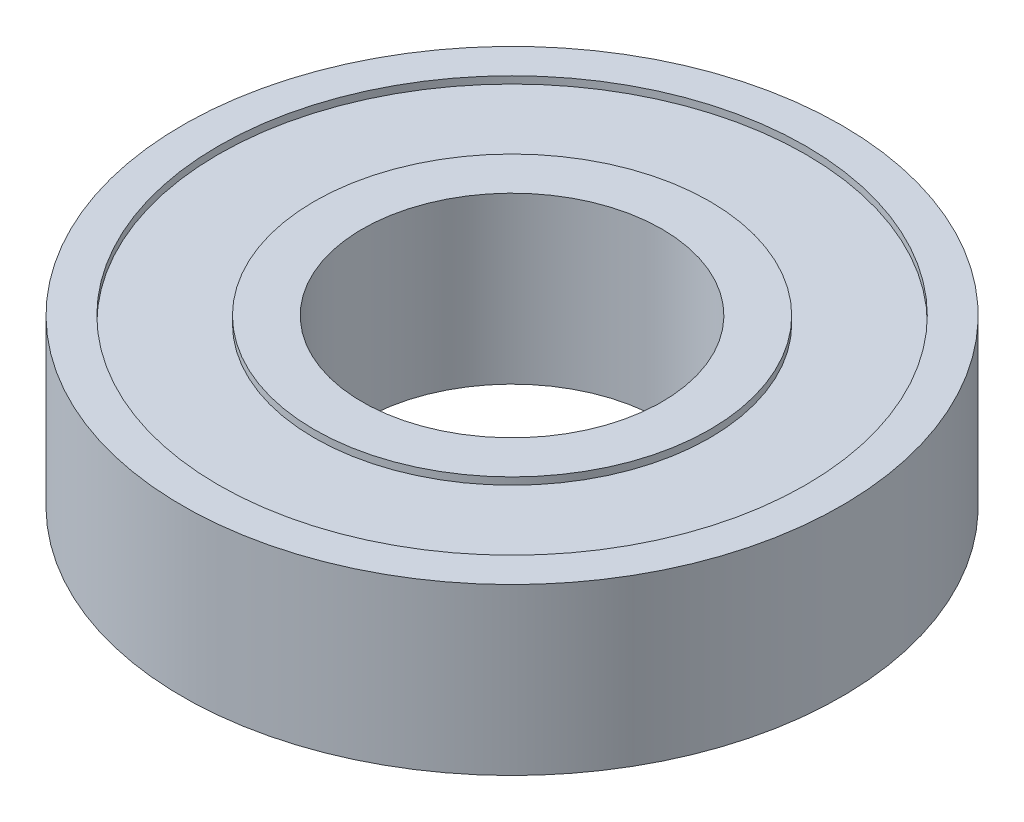
ISO-10303-21;
HEADER;
FILE_DESCRIPTION(('STEP AP214'),'2;1');
FILE_NAME('part.step','',(''),(''),'','','');
FILE_SCHEMA(('AUTOMOTIVE_DESIGN { 1 0 10303 214 1 1 1 1 }'));
ENDSEC;
DATA;
#1=APPLICATION_CONTEXT('core data for automotive mechanical design processes');
#2=APPLICATION_PROTOCOL_DEFINITION('international standard','automotive_design',2000,#1);
#3=PRODUCT_CONTEXT('',#1,'mechanical');
#4=PRODUCT('Part','Part','',(#3));
#5=PRODUCT_RELATED_PRODUCT_CATEGORY('part','',(#4));
#6=PRODUCT_DEFINITION_FORMATION('','',#4);
#7=PRODUCT_DEFINITION_CONTEXT('part definition',#1,'design');
#8=PRODUCT_DEFINITION('design','',#6,#7);
#9=PRODUCT_DEFINITION_SHAPE('','',#8);
#10=(LENGTH_UNIT() NAMED_UNIT(*) SI_UNIT(.MILLI.,.METRE.));
#11=(NAMED_UNIT(*) PLANE_ANGLE_UNIT() SI_UNIT($,.RADIAN.));
#12=(NAMED_UNIT(*) SI_UNIT($,.STERADIAN.) SOLID_ANGLE_UNIT());
#13=UNCERTAINTY_MEASURE_WITH_UNIT(LENGTH_MEASURE(1.E-05),#10,'distance_accuracy_value','');
#14=(GEOMETRIC_REPRESENTATION_CONTEXT(3) GLOBAL_UNCERTAINTY_ASSIGNED_CONTEXT((#13)) GLOBAL_UNIT_ASSIGNED_CONTEXT((#10,
#11,#12)) REPRESENTATION_CONTEXT('',''));
#15=CARTESIAN_POINT('',(0.,0.,0.));
#16=DIRECTION('',(0.,0.,1.));
#17=DIRECTION('',(1.,0.,0.));
#18=AXIS2_PLACEMENT_3D('',#15,#16,#17);
#19=CARTESIAN_POINT('',(7.9375,-0.381,0.));
#20=DIRECTION('',(0.,-1.,0.));
#21=DIRECTION('',(0.,0.,-1.));
#22=AXIS2_PLACEMENT_3D('',#19,#20,#21);
#23=PLANE('',#22);
#24=CARTESIAN_POINT('',(0.,-0.381,0.));
#25=DIRECTION('',(0.,-1.,0.));
#26=DIRECTION('',(0.,0.,-1.));
#27=AXIS2_PLACEMENT_3D('',#24,#25,#26);
#28=CIRCLE('',#27,10.4775);
#29=CARTESIAN_POINT('',(0.,-0.381,-10.4775));
#30=VERTEX_POINT('',#29);
#31=EDGE_CURVE('E10',#30,#30,#28,.T.);
#32=ORIENTED_EDGE('',*,*,#31,.T.);
#33=EDGE_LOOP('',(#32));
#34=FACE_BOUND('',#33,.T.);
#35=CARTESIAN_POINT('',(0.,-0.381,0.));
#36=DIRECTION('',(0.,-1.,0.));
#37=DIRECTION('',(0.,0.,-1.));
#38=AXIS2_PLACEMENT_3D('',#35,#36,#37);
#39=CIRCLE('',#38,7.9375);
#40=CARTESIAN_POINT('',(0.,-0.381,-7.9375));
#41=VERTEX_POINT('',#40);
#42=EDGE_CURVE('E71',#41,#41,#39,.T.);
#43=ORIENTED_EDGE('',*,*,#42,.F.);
#44=EDGE_LOOP('',(#43));
#45=FACE_BOUND('',#44,.T.);
#46=ADVANCED_FACE('F31',(#34,#45),#23,.T.);
#47=CARTESIAN_POINT('',(0.,0.,0.));
#48=DIRECTION('',(0.,-1.,0.));
#49=DIRECTION('',(0.,0.,-1.));
#50=AXIS2_PLACEMENT_3D('',#47,#48,#49);
#51=CYLINDRICAL_SURFACE('',#50,10.4775);
#52=CARTESIAN_POINT('',(0.,0.,0.));
#53=DIRECTION('',(0.,-1.,0.));
#54=DIRECTION('',(0.,0.,-1.));
#55=AXIS2_PLACEMENT_3D('',#52,#53,#54);
#56=CIRCLE('',#55,10.4775);
#57=CARTESIAN_POINT('',(0.,0.,-10.4775));
#58=VERTEX_POINT('',#57);
#59=EDGE_CURVE('E37',#58,#58,#56,.T.);
#60=ORIENTED_EDGE('',*,*,#59,.T.);
#61=EDGE_LOOP('',(#60));
#62=FACE_BOUND('',#61,.T.);
#63=ORIENTED_EDGE('',*,*,#31,.F.);
#64=EDGE_LOOP('',(#63));
#65=FACE_BOUND('',#64,.T.);
#66=ADVANCED_FACE('F79',(#62,#65),#51,.T.);
#67=CARTESIAN_POINT('',(10.4775,0.,0.));
#68=DIRECTION('',(0.,-1.,0.));
#69=DIRECTION('',(0.,0.,-1.));
#70=AXIS2_PLACEMENT_3D('',#67,#68,#69);
#71=PLANE('',#70);
#72=CARTESIAN_POINT('',(0.,0.,0.));
#73=DIRECTION('',(0.,-1.,0.));
#74=DIRECTION('',(0.,0.,-1.));
#75=AXIS2_PLACEMENT_3D('',#72,#73,#74);
#76=CIRCLE('',#75,15.5575);
#77=CARTESIAN_POINT('',(0.,0.,-15.5575));
#78=VERTEX_POINT('',#77);
#79=EDGE_CURVE('E41',#78,#78,#76,.T.);
#80=ORIENTED_EDGE('',*,*,#79,.T.);
#81=EDGE_LOOP('',(#80));
#82=FACE_BOUND('',#81,.T.);
#83=ORIENTED_EDGE('',*,*,#59,.F.);
#84=EDGE_LOOP('',(#83));
#85=FACE_BOUND('',#84,.T.);
#86=ADVANCED_FACE('F83',(#82,#85),#71,.T.);
#87=CARTESIAN_POINT('',(0.,0.,0.));
#88=DIRECTION('',(0.,-1.,0.));
#89=DIRECTION('',(0.,0.,-1.));
#90=AXIS2_PLACEMENT_3D('',#87,#88,#89);
#91=CYLINDRICAL_SURFACE('',#90,15.5575);
#92=CARTESIAN_POINT('',(0.,-0.381,0.));
#93=DIRECTION('',(0.,-1.,0.));
#94=DIRECTION('',(0.,0.,-1.));
#95=AXIS2_PLACEMENT_3D('',#92,#93,#94);
#96=CIRCLE('',#95,15.5575);
#97=CARTESIAN_POINT('',(0.,-0.381,-15.5575));
#98=VERTEX_POINT('',#97);
#99=EDGE_CURVE('E45',#98,#98,#96,.T.);
#100=ORIENTED_EDGE('',*,*,#99,.T.);
#101=EDGE_LOOP('',(#100));
#102=FACE_BOUND('',#101,.T.);
#103=ORIENTED_EDGE('',*,*,#79,.F.);
#104=EDGE_LOOP('',(#103));
#105=FACE_BOUND('',#104,.T.);
#106=ADVANCED_FACE('F87',(#102,#105),#91,.F.);
#107=CARTESIAN_POINT('',(15.5575,-0.381,0.));
#108=DIRECTION('',(0.,-1.,0.));
#109=DIRECTION('',(0.,0.,-1.));
#110=AXIS2_PLACEMENT_3D('',#107,#108,#109);
#111=PLANE('',#110);
#112=CARTESIAN_POINT('',(0.,-0.381,0.));
#113=DIRECTION('',(0.,-1.,0.));
#114=DIRECTION('',(0.,0.,-1.));
#115=AXIS2_PLACEMENT_3D('',#112,#113,#114);
#116=CIRCLE('',#115,17.4625);
#117=CARTESIAN_POINT('',(0.,-0.381,-17.4625));
#118=VERTEX_POINT('',#117);
#119=EDGE_CURVE('E50',#118,#118,#116,.T.);
#120=ORIENTED_EDGE('',*,*,#119,.T.);
#121=EDGE_LOOP('',(#120));
#122=FACE_BOUND('',#121,.T.);
#123=ORIENTED_EDGE('',*,*,#99,.F.);
#124=EDGE_LOOP('',(#123));
#125=FACE_BOUND('',#124,.T.);
#126=ADVANCED_FACE('F94',(#122,#125),#111,.T.);
#127=CARTESIAN_POINT('',(0.,0.,0.));
#128=DIRECTION('',(0.,-1.,0.));
#129=DIRECTION('',(0.,0.,-1.));
#130=AXIS2_PLACEMENT_3D('',#127,#128,#129);
#131=CYLINDRICAL_SURFACE('',#130,17.4625);
#132=CARTESIAN_POINT('',(0.,8.382,0.));
#133=DIRECTION('',(0.,-1.,0.));
#134=DIRECTION('',(0.,0.,-1.));
#135=AXIS2_PLACEMENT_3D('',#132,#133,#134);
#136=CIRCLE('',#135,17.4625);
#137=CARTESIAN_POINT('',(0.,8.382,-17.4625));
#138=VERTEX_POINT('',#137);
#139=EDGE_CURVE('E53',#138,#138,#136,.T.);
#140=ORIENTED_EDGE('',*,*,#139,.T.);
#141=EDGE_LOOP('',(#140));
#142=FACE_BOUND('',#141,.T.);
#143=ORIENTED_EDGE('',*,*,#119,.F.);
#144=EDGE_LOOP('',(#143));
#145=FACE_BOUND('',#144,.T.);
#146=ADVANCED_FACE('F98',(#142,#145),#131,.T.);
#147=CARTESIAN_POINT('',(15.5575,8.382,0.));
#148=DIRECTION('',(0.,1.,0.));
#149=DIRECTION('',(0.,0.,1.));
#150=AXIS2_PLACEMENT_3D('',#147,#148,#149);
#151=PLANE('',#150);
#152=CARTESIAN_POINT('',(0.,8.382,0.));
#153=DIRECTION('',(0.,-1.,0.));
#154=DIRECTION('',(0.,0.,-1.));
#155=AXIS2_PLACEMENT_3D('',#152,#153,#154);
#156=CIRCLE('',#155,15.5575);
#157=CARTESIAN_POINT('',(0.,8.382,-15.5575));
#158=VERTEX_POINT('',#157);
#159=EDGE_CURVE('E56',#158,#158,#156,.T.);
#160=ORIENTED_EDGE('',*,*,#159,.T.);
#161=EDGE_LOOP('',(#160));
#162=FACE_BOUND('',#161,.T.);
#163=ORIENTED_EDGE('',*,*,#139,.F.);
#164=EDGE_LOOP('',(#163));
#165=FACE_BOUND('',#164,.T.);
#166=ADVANCED_FACE('F102',(#162,#165),#151,.T.);
#167=CARTESIAN_POINT('',(0.,0.,0.));
#168=DIRECTION('',(0.,-1.,0.));
#169=DIRECTION('',(0.,0.,-1.));
#170=AXIS2_PLACEMENT_3D('',#167,#168,#169);
#171=CYLINDRICAL_SURFACE('',#170,15.5575);
#172=CARTESIAN_POINT('',(0.,8.001,0.));
#173=DIRECTION('',(0.,-1.,0.));
#174=DIRECTION('',(0.,0.,-1.));
#175=AXIS2_PLACEMENT_3D('',#172,#173,#174);
#176=CIRCLE('',#175,15.5575);
#177=CARTESIAN_POINT('',(0.,8.001,-15.5575));
#178=VERTEX_POINT('',#177);
#179=EDGE_CURVE('E59',#178,#178,#176,.T.);
#180=ORIENTED_EDGE('',*,*,#179,.T.);
#181=EDGE_LOOP('',(#180));
#182=FACE_BOUND('',#181,.T.);
#183=ORIENTED_EDGE('',*,*,#159,.F.);
#184=EDGE_LOOP('',(#183));
#185=FACE_BOUND('',#184,.T.);
#186=ADVANCED_FACE('F106',(#182,#185),#171,.F.);
#187=CARTESIAN_POINT('',(10.4775,8.001,0.));
#188=DIRECTION('',(0.,1.,0.));
#189=DIRECTION('',(0.,0.,1.));
#190=AXIS2_PLACEMENT_3D('',#187,#188,#189);
#191=PLANE('',#190);
#192=CARTESIAN_POINT('',(0.,8.001,0.));
#193=DIRECTION('',(0.,-1.,0.));
#194=DIRECTION('',(0.,0.,-1.));
#195=AXIS2_PLACEMENT_3D('',#192,#193,#194);
#196=CIRCLE('',#195,10.4775);
#197=CARTESIAN_POINT('',(0.,8.001,-10.4775));
#198=VERTEX_POINT('',#197);
#199=EDGE_CURVE('E62',#198,#198,#196,.T.);
#200=ORIENTED_EDGE('',*,*,#199,.T.);
#201=EDGE_LOOP('',(#200));
#202=FACE_BOUND('',#201,.T.);
#203=ORIENTED_EDGE('',*,*,#179,.F.);
#204=EDGE_LOOP('',(#203));
#205=FACE_BOUND('',#204,.T.);
#206=ADVANCED_FACE('F110',(#202,#205),#191,.T.);
#207=CARTESIAN_POINT('',(0.,0.,0.));
#208=DIRECTION('',(0.,-1.,0.));
#209=DIRECTION('',(0.,0.,-1.));
#210=AXIS2_PLACEMENT_3D('',#207,#208,#209);
#211=CYLINDRICAL_SURFACE('',#210,10.4775);
#212=CARTESIAN_POINT('',(0.,8.382,0.));
#213=DIRECTION('',(0.,-1.,0.));
#214=DIRECTION('',(0.,0.,-1.));
#215=AXIS2_PLACEMENT_3D('',#212,#213,#214);
#216=CIRCLE('',#215,10.4775);
#217=CARTESIAN_POINT('',(0.,8.382,-10.4775));
#218=VERTEX_POINT('',#217);
#219=EDGE_CURVE('E65',#218,#218,#216,.T.);
#220=ORIENTED_EDGE('',*,*,#219,.T.);
#221=EDGE_LOOP('',(#220));
#222=FACE_BOUND('',#221,.T.);
#223=ORIENTED_EDGE('',*,*,#199,.F.);
#224=EDGE_LOOP('',(#223));
#225=FACE_BOUND('',#224,.T.);
#226=ADVANCED_FACE('F114',(#222,#225),#211,.T.);
#227=CARTESIAN_POINT('',(7.9375,8.382,0.));
#228=DIRECTION('',(0.,1.,0.));
#229=DIRECTION('',(0.,0.,1.));
#230=AXIS2_PLACEMENT_3D('',#227,#228,#229);
#231=PLANE('',#230);
#232=CARTESIAN_POINT('',(0.,8.382,0.));
#233=DIRECTION('',(0.,-1.,0.));
#234=DIRECTION('',(0.,0.,-1.));
#235=AXIS2_PLACEMENT_3D('',#232,#233,#234);
#236=CIRCLE('',#235,7.9375);
#237=CARTESIAN_POINT('',(0.,8.382,-7.9375));
#238=VERTEX_POINT('',#237);
#239=EDGE_CURVE('E68',#238,#238,#236,.T.);
#240=ORIENTED_EDGE('',*,*,#239,.T.);
#241=EDGE_LOOP('',(#240));
#242=FACE_BOUND('',#241,.T.);
#243=ORIENTED_EDGE('',*,*,#219,.F.);
#244=EDGE_LOOP('',(#243));
#245=FACE_BOUND('',#244,.T.);
#246=ADVANCED_FACE('F118',(#242,#245),#231,.T.);
#247=CARTESIAN_POINT('',(0.,0.,0.));
#248=DIRECTION('',(0.,-1.,0.));
#249=DIRECTION('',(0.,0.,-1.));
#250=AXIS2_PLACEMENT_3D('',#247,#248,#249);
#251=CYLINDRICAL_SURFACE('',#250,7.9375);
#252=ORIENTED_EDGE('',*,*,#42,.T.);
#253=EDGE_LOOP('',(#252));
#254=FACE_BOUND('',#253,.T.);
#255=ORIENTED_EDGE('',*,*,#239,.F.);
#256=EDGE_LOOP('',(#255));
#257=FACE_BOUND('',#256,.T.);
#258=ADVANCED_FACE('F75',(#254,#257),#251,.F.);
#259=CLOSED_SHELL('',(#46,#66,#86,#106,#126,#146,#166,#186,#206,#226,#246,#258));
#260=MANIFOLD_SOLID_BREP('B2',#259);
#261=ADVANCED_BREP_SHAPE_REPRESENTATION('',(#18,#260),#14);
#262=SHAPE_DEFINITION_REPRESENTATION(#9,#261);
ENDSEC;
END-ISO-10303-21;
